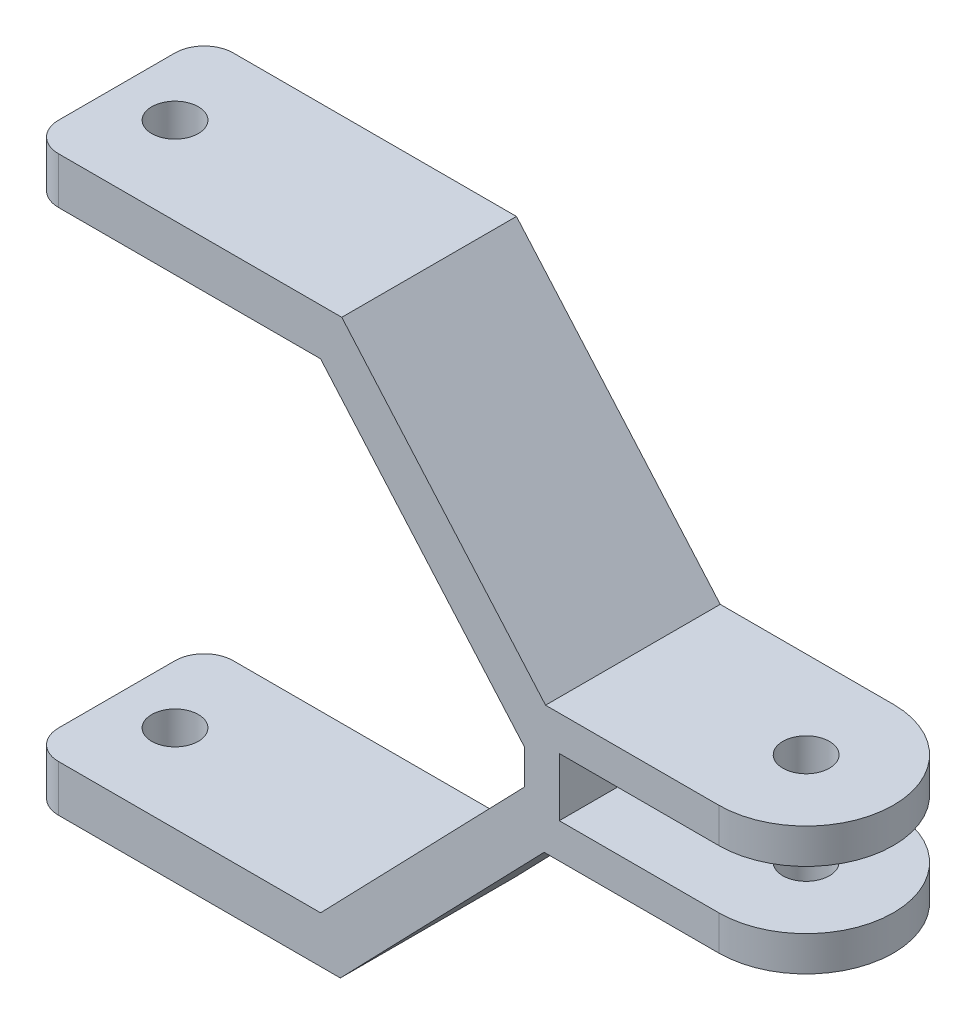
ISO-10303-21;
HEADER;
FILE_DESCRIPTION(('STEP AP214'),'2;1');
FILE_NAME('part.step','',(''),(''),'','','');
FILE_SCHEMA(('AUTOMOTIVE_DESIGN { 1 0 10303 214 1 1 1 1 }'));
ENDSEC;
DATA;
#1=APPLICATION_CONTEXT('core data for automotive mechanical design processes');
#2=APPLICATION_PROTOCOL_DEFINITION('international standard','automotive_design',2000,#1);
#3=PRODUCT_CONTEXT('',#1,'mechanical');
#4=PRODUCT('Part','Part','',(#3));
#5=PRODUCT_RELATED_PRODUCT_CATEGORY('part','',(#4));
#6=PRODUCT_DEFINITION_FORMATION('','',#4);
#7=PRODUCT_DEFINITION_CONTEXT('part definition',#1,'design');
#8=PRODUCT_DEFINITION('design','',#6,#7);
#9=PRODUCT_DEFINITION_SHAPE('','',#8);
#10=(LENGTH_UNIT() NAMED_UNIT(*) SI_UNIT(.MILLI.,.METRE.));
#11=(NAMED_UNIT(*) PLANE_ANGLE_UNIT() SI_UNIT($,.RADIAN.));
#12=(NAMED_UNIT(*) SI_UNIT($,.STERADIAN.) SOLID_ANGLE_UNIT());
#13=UNCERTAINTY_MEASURE_WITH_UNIT(LENGTH_MEASURE(1.E-05),#10,'distance_accuracy_value','');
#14=(GEOMETRIC_REPRESENTATION_CONTEXT(3) GLOBAL_UNCERTAINTY_ASSIGNED_CONTEXT((#13)) GLOBAL_UNIT_ASSIGNED_CONTEXT((#10,
#11,#12)) REPRESENTATION_CONTEXT('',''));
#15=CARTESIAN_POINT('',(0.,0.,0.));
#16=DIRECTION('',(0.,0.,1.));
#17=DIRECTION('',(1.,0.,0.));
#18=AXIS2_PLACEMENT_3D('',#15,#16,#17);
#19=CARTESIAN_POINT('',(-26.6964809757769,45.2,15.));
#20=DIRECTION('',(0.75420147757774,0.656643077493058,0.));
#21=DIRECTION('',(-0.656643077493058,0.75420147757774,0.));
#22=AXIS2_PLACEMENT_3D('',#19,#20,#21);
#23=PLANE('',#22);
#24=DIRECTION('',(0.656643077493058,-0.75420147757774,0.));
#25=VECTOR('',#24,1.);
#26=CARTESIAN_POINT('',(-26.6964809757769,45.2,0.));
#27=LINE('',#26,#25);
#28=CARTESIAN_POINT('',(-26.6964809757769,45.2,0.));
#29=VERTEX_POINT('',#28);
#30=CARTESIAN_POINT('',(-9.19648097577691,25.1,0.));
#31=VERTEX_POINT('',#30);
#32=EDGE_CURVE('E231',#29,#31,#27,.T.);
#33=ORIENTED_EDGE('',*,*,#32,.T.);
#34=DIRECTION('',(0.,0.,-1.));
#35=VECTOR('',#34,1.);
#36=CARTESIAN_POINT('',(-9.19648097577691,25.1,15.));
#37=LINE('',#36,#35);
#38=CARTESIAN_POINT('',(-9.19648097577691,25.1,15.));
#39=VERTEX_POINT('',#38);
#40=EDGE_CURVE('E332',#39,#31,#37,.T.);
#41=ORIENTED_EDGE('',*,*,#40,.F.);
#42=DIRECTION('',(0.656643077493058,-0.75420147757774,0.));
#43=VECTOR('',#42,1.);
#44=CARTESIAN_POINT('',(-26.6964809757769,45.2,15.));
#45=LINE('',#44,#43);
#46=CARTESIAN_POINT('',(-26.6964809757769,45.2,15.));
#47=VERTEX_POINT('',#46);
#48=EDGE_CURVE('E232',#47,#39,#45,.T.);
#49=ORIENTED_EDGE('',*,*,#48,.F.);
#50=DIRECTION('',(0.,0.,-1.));
#51=VECTOR('',#50,1.);
#52=CARTESIAN_POINT('',(-26.6964809757769,45.2,15.));
#53=LINE('',#52,#51);
#54=EDGE_CURVE('E267',#47,#29,#53,.T.);
#55=ORIENTED_EDGE('',*,*,#54,.T.);
#56=EDGE_LOOP('',(#33,#41,#49,#55));
#57=FACE_BOUND('',#56,.T.);
#58=ADVANCED_FACE('F33',(#57),#23,.F.);
#59=CARTESIAN_POINT('',(-9.19648097577691,25.1,15.));
#60=DIRECTION('',(1.,0.,0.));
#61=DIRECTION('',(0.,1.,0.));
#62=AXIS2_PLACEMENT_3D('',#59,#60,#61);
#63=PLANE('',#62);
#64=DIRECTION('',(0.,-1.,0.));
#65=VECTOR('',#64,1.);
#66=CARTESIAN_POINT('',(-9.19648097577691,25.1,0.));
#67=LINE('',#66,#65);
#68=CARTESIAN_POINT('',(-9.19648097577692,22.1,0.));
#69=VERTEX_POINT('',#68);
#70=EDGE_CURVE('E270',#31,#69,#67,.T.);
#71=ORIENTED_EDGE('',*,*,#70,.T.);
#72=DIRECTION('',(0.,0.,-1.));
#73=VECTOR('',#72,1.);
#74=CARTESIAN_POINT('',(-9.19648097577692,22.1,15.));
#75=LINE('',#74,#73);
#76=CARTESIAN_POINT('',(-9.19648097577692,22.1,15.));
#77=VERTEX_POINT('',#76);
#78=EDGE_CURVE('E329',#77,#69,#75,.T.);
#79=ORIENTED_EDGE('',*,*,#78,.F.);
#80=DIRECTION('',(0.,-1.,0.));
#81=VECTOR('',#80,1.);
#82=CARTESIAN_POINT('',(-9.19648097577691,25.1,15.));
#83=LINE('',#82,#81);
#84=EDGE_CURVE('E235',#39,#77,#83,.T.);
#85=ORIENTED_EDGE('',*,*,#84,.F.);
#86=ORIENTED_EDGE('',*,*,#40,.T.);
#87=EDGE_LOOP('',(#71,#79,#85,#86));
#88=FACE_BOUND('',#87,.T.);
#89=ADVANCED_FACE('F398',(#88),#63,.F.);
#90=CARTESIAN_POINT('',(-9.19648097577692,22.1,15.));
#91=DIRECTION('',(0.718922211716419,-0.695090536189907,0.));
#92=DIRECTION('',(0.695090536189907,0.718922211716419,0.));
#93=AXIS2_PLACEMENT_3D('',#90,#91,#92);
#94=PLANE('',#93);
#95=DIRECTION('',(-0.695090536189907,-0.718922211716419,0.));
#96=VECTOR('',#95,1.);
#97=CARTESIAN_POINT('',(-9.19648097577692,22.1,0.));
#98=LINE('',#97,#96);
#99=CARTESIAN_POINT('',(-26.6964809757769,4.,0.));
#100=VERTEX_POINT('',#99);
#101=EDGE_CURVE('E272',#69,#100,#98,.T.);
#102=ORIENTED_EDGE('',*,*,#101,.T.);
#103=DIRECTION('',(0.,0.,-1.));
#104=VECTOR('',#103,1.);
#105=CARTESIAN_POINT('',(-26.6964809757769,4.,15.));
#106=LINE('',#105,#104);
#107=CARTESIAN_POINT('',(-26.6964809757769,4.,15.));
#108=VERTEX_POINT('',#107);
#109=EDGE_CURVE('E326',#108,#100,#106,.T.);
#110=ORIENTED_EDGE('',*,*,#109,.F.);
#111=DIRECTION('',(-0.695090536189907,-0.718922211716419,0.));
#112=VECTOR('',#111,1.);
#113=CARTESIAN_POINT('',(-9.19648097577692,22.1,15.));
#114=LINE('',#113,#112);
#115=EDGE_CURVE('E238',#77,#108,#114,.T.);
#116=ORIENTED_EDGE('',*,*,#115,.F.);
#117=ORIENTED_EDGE('',*,*,#78,.T.);
#118=EDGE_LOOP('',(#102,#110,#116,#117));
#119=FACE_BOUND('',#118,.T.);
#120=ADVANCED_FACE('F386',(#119),#94,.F.);
#121=CARTESIAN_POINT('',(-51.6964809757769,3.99999999999999,15.));
#122=DIRECTION('',(0.,-1.,0.));
#123=DIRECTION('',(0.,0.,-1.));
#124=AXIS2_PLACEMENT_3D('',#121,#122,#123);
#125=PLANE('',#124);
#126=CARTESIAN_POINT('',(-46.6964809757769,3.99999999999999,7.5));
#127=DIRECTION('',(0.,-1.,0.));
#128=DIRECTION('',(0.,0.,-1.));
#129=AXIS2_PLACEMENT_3D('',#126,#127,#128);
#130=CIRCLE('',#129,2.);
#131=CARTESIAN_POINT('',(-44.6964809757769,4.,7.5));
#132=VERTEX_POINT('',#131);
#133=EDGE_CURVE('E228',#132,#132,#130,.T.);
#134=ORIENTED_EDGE('',*,*,#133,.T.);
#135=EDGE_LOOP('',(#134));
#136=FACE_BOUND('',#135,.T.);
#137=DIRECTION('',(0.,0.,-1.));
#138=VECTOR('',#137,1.);
#139=CARTESIAN_POINT('',(-51.6964809757769,3.99999999999999,15.));
#140=LINE('',#139,#138);
#141=CARTESIAN_POINT('',(-51.6964809757769,3.99999999999999,12.5));
#142=VERTEX_POINT('',#141);
#143=CARTESIAN_POINT('',(-51.6964809757769,3.99999999999999,2.5));
#144=VERTEX_POINT('',#143);
#145=EDGE_CURVE('E324',#142,#144,#140,.T.);
#146=ORIENTED_EDGE('',*,*,#145,.F.);
#147=CARTESIAN_POINT('',(-49.1964809757769,3.99999999999999,12.5));
#148=DIRECTION('',(0.,-1.,0.));
#149=DIRECTION('',(0.,0.,-1.));
#150=AXIS2_PLACEMENT_3D('',#147,#148,#149);
#151=CIRCLE('',#150,2.5);
#152=CARTESIAN_POINT('',(-49.1964809757769,3.99999999999999,15.));
#153=VERTEX_POINT('',#152);
#154=EDGE_CURVE('E11',#142,#153,#151,.F.);
#155=ORIENTED_EDGE('',*,*,#154,.T.);
#156=DIRECTION('',(-1.,0.,0.));
#157=VECTOR('',#156,1.);
#158=CARTESIAN_POINT('',(-26.6964809757769,4.,15.));
#159=LINE('',#158,#157);
#160=EDGE_CURVE('E240',#108,#153,#159,.T.);
#161=ORIENTED_EDGE('',*,*,#160,.F.);
#162=ORIENTED_EDGE('',*,*,#109,.T.);
#163=DIRECTION('',(-1.,0.,0.));
#164=VECTOR('',#163,1.);
#165=CARTESIAN_POINT('',(-51.6964809757769,3.99999999999999,0.));
#166=LINE('',#165,#164);
#167=CARTESIAN_POINT('',(-49.1964809757769,3.99999999999999,0.));
#168=VERTEX_POINT('',#167);
#169=EDGE_CURVE('E275',#100,#168,#166,.T.);
#170=ORIENTED_EDGE('',*,*,#169,.T.);
#171=CARTESIAN_POINT('',(-49.1964809757769,3.99999999999999,2.5));
#172=DIRECTION('',(0.,-1.,0.));
#173=DIRECTION('',(0.,0.,-1.));
#174=AXIS2_PLACEMENT_3D('',#171,#172,#173);
#175=CIRCLE('',#174,2.5);
#176=EDGE_CURVE('E41',#168,#144,#175,.F.);
#177=ORIENTED_EDGE('',*,*,#176,.T.);
#178=EDGE_LOOP('',(#146,#155,#161,#162,#170,#177));
#179=FACE_BOUND('',#178,.T.);
#180=ADVANCED_FACE('F384',(#136,#179),#125,.F.);
#181=CARTESIAN_POINT('',(-51.6964809757769,0.,15.));
#182=DIRECTION('',(1.,0.,0.));
#183=DIRECTION('',(0.,0.,-1.));
#184=AXIS2_PLACEMENT_3D('',#181,#182,#183);
#185=PLANE('',#184);
#186=DIRECTION('',(0.,0.,-1.));
#187=VECTOR('',#186,1.);
#188=CARTESIAN_POINT('',(-51.6964809757769,0.,15.));
#189=LINE('',#188,#187);
#190=CARTESIAN_POINT('',(-51.6964809757769,0.,12.5));
#191=VERTEX_POINT('',#190);
#192=CARTESIAN_POINT('',(-51.6964809757769,0.,2.5));
#193=VERTEX_POINT('',#192);
#194=EDGE_CURVE('E321',#191,#193,#189,.T.);
#195=ORIENTED_EDGE('',*,*,#194,.F.);
#196=DIRECTION('',(0.,-1.,0.));
#197=VECTOR('',#196,1.);
#198=CARTESIAN_POINT('',(-51.6964809757769,0.,12.5));
#199=LINE('',#198,#197);
#200=EDGE_CURVE('E54',#191,#142,#199,.F.);
#201=ORIENTED_EDGE('',*,*,#200,.T.);
#202=ORIENTED_EDGE('',*,*,#145,.T.);
#203=DIRECTION('',(0.,-1.,0.));
#204=VECTOR('',#203,1.);
#205=CARTESIAN_POINT('',(-51.6964809757769,0.,2.5));
#206=LINE('',#205,#204);
#207=EDGE_CURVE('E364',#144,#193,#206,.T.);
#208=ORIENTED_EDGE('',*,*,#207,.T.);
#209=EDGE_LOOP('',(#195,#201,#202,#208));
#210=FACE_BOUND('',#209,.T.);
#211=ADVANCED_FACE('F368',(#210),#185,.F.);
#212=CARTESIAN_POINT('',(-25.,0.,15.));
#213=DIRECTION('',(0.,1.,0.));
#214=DIRECTION('',(-1.,0.,0.));
#215=AXIS2_PLACEMENT_3D('',#212,#213,#214);
#216=PLANE('',#215);
#217=CARTESIAN_POINT('',(-46.6964809757769,0.,7.5));
#218=DIRECTION('',(0.,-1.,0.));
#219=DIRECTION('',(1.,0.,0.));
#220=AXIS2_PLACEMENT_3D('',#217,#218,#219);
#221=CIRCLE('',#220,2.);
#222=CARTESIAN_POINT('',(-44.6964809757769,0.,7.5));
#223=VERTEX_POINT('',#222);
#224=EDGE_CURVE('E219',#223,#223,#221,.T.);
#225=ORIENTED_EDGE('',*,*,#224,.F.);
#226=EDGE_LOOP('',(#225));
#227=FACE_BOUND('',#226,.T.);
#228=DIRECTION('',(1.,0.,0.));
#229=VECTOR('',#228,1.);
#230=CARTESIAN_POINT('',(-25.,0.,15.));
#231=LINE('',#230,#229);
#232=CARTESIAN_POINT('',(-49.1964809757769,0.,15.));
#233=VERTEX_POINT('',#232);
#234=CARTESIAN_POINT('',(-25.,0.,15.));
#235=VERTEX_POINT('',#234);
#236=EDGE_CURVE('E243',#233,#235,#231,.T.);
#237=ORIENTED_EDGE('',*,*,#236,.F.);
#238=CARTESIAN_POINT('',(-49.1964809757769,0.,12.5));
#239=DIRECTION('',(0.,1.,0.));
#240=DIRECTION('',(-1.,0.,0.));
#241=AXIS2_PLACEMENT_3D('',#238,#239,#240);
#242=CIRCLE('',#241,2.5);
#243=EDGE_CURVE('E362',#233,#191,#242,.F.);
#244=ORIENTED_EDGE('',*,*,#243,.T.);
#245=ORIENTED_EDGE('',*,*,#194,.T.);
#246=CARTESIAN_POINT('',(-49.1964809757769,0.,2.5));
#247=DIRECTION('',(0.,1.,0.));
#248=DIRECTION('',(-1.,0.,0.));
#249=AXIS2_PLACEMENT_3D('',#246,#247,#248);
#250=CIRCLE('',#249,2.5);
#251=CARTESIAN_POINT('',(-49.1964809757769,0.,0.));
#252=VERTEX_POINT('',#251);
#253=EDGE_CURVE('E360',#193,#252,#250,.F.);
#254=ORIENTED_EDGE('',*,*,#253,.T.);
#255=DIRECTION('',(1.,0.,0.));
#256=VECTOR('',#255,1.);
#257=CARTESIAN_POINT('',(-25.,0.,0.));
#258=LINE('',#257,#256);
#259=CARTESIAN_POINT('',(-25.,0.,0.));
#260=VERTEX_POINT('',#259);
#261=EDGE_CURVE('E277',#252,#260,#258,.T.);
#262=ORIENTED_EDGE('',*,*,#261,.T.);
#263=DIRECTION('',(0.,0.,-1.));
#264=VECTOR('',#263,1.);
#265=CARTESIAN_POINT('',(-25.,0.,15.));
#266=LINE('',#265,#264);
#267=EDGE_CURVE('E318',#235,#260,#266,.T.);
#268=ORIENTED_EDGE('',*,*,#267,.F.);
#269=EDGE_LOOP('',(#237,#244,#245,#254,#262,#268));
#270=FACE_BOUND('',#269,.T.);
#271=ADVANCED_FACE('F372',(#227,#270),#216,.F.);
#272=CARTESIAN_POINT('',(-7.5,18.1,15.));
#273=DIRECTION('',(-0.718922211716419,0.695090536189907,0.));
#274=DIRECTION('',(-0.695090536189907,-0.718922211716419,0.));
#275=AXIS2_PLACEMENT_3D('',#272,#273,#274);
#276=PLANE('',#275);
#277=DIRECTION('',(0.695090536189907,0.718922211716419,0.));
#278=VECTOR('',#277,1.);
#279=CARTESIAN_POINT('',(-7.5,18.1,0.));
#280=LINE('',#279,#278);
#281=CARTESIAN_POINT('',(-7.5,18.1,0.));
#282=VERTEX_POINT('',#281);
#283=EDGE_CURVE('E279',#260,#282,#280,.T.);
#284=ORIENTED_EDGE('',*,*,#283,.T.);
#285=DIRECTION('',(0.,0.,-1.));
#286=VECTOR('',#285,1.);
#287=CARTESIAN_POINT('',(-7.5,18.1,15.));
#288=LINE('',#287,#286);
#289=CARTESIAN_POINT('',(-7.5,18.1,15.));
#290=VERTEX_POINT('',#289);
#291=EDGE_CURVE('E315',#290,#282,#288,.T.);
#292=ORIENTED_EDGE('',*,*,#291,.F.);
#293=DIRECTION('',(0.695090536189907,0.718922211716419,0.));
#294=VECTOR('',#293,1.);
#295=CARTESIAN_POINT('',(-7.5,18.1,15.));
#296=LINE('',#295,#294);
#297=EDGE_CURVE('E245',#235,#290,#296,.T.);
#298=ORIENTED_EDGE('',*,*,#297,.F.);
#299=ORIENTED_EDGE('',*,*,#267,.T.);
#300=EDGE_LOOP('',(#284,#292,#298,#299));
#301=FACE_BOUND('',#300,.T.);
#302=ADVANCED_FACE('F474',(#301),#276,.F.);
#303=CARTESIAN_POINT('',(-7.5,18.1,15.));
#304=DIRECTION('',(0.,1.,0.));
#305=DIRECTION('',(0.,0.,1.));
#306=AXIS2_PLACEMENT_3D('',#303,#304,#305);
#307=PLANE('',#306);
#308=CARTESIAN_POINT('',(7.50000000000001,18.1,7.5));
#309=DIRECTION('',(0.,1.,0.));
#310=DIRECTION('',(0.,0.,1.));
#311=AXIS2_PLACEMENT_3D('',#308,#309,#310);
#312=CIRCLE('',#311,2.);
#313=CARTESIAN_POINT('',(7.50000000000001,18.1,9.5));
#314=VERTEX_POINT('',#313);
#315=EDGE_CURVE('E714',#314,#314,#312,.T.);
#316=ORIENTED_EDGE('',*,*,#315,.T.);
#317=EDGE_LOOP('',(#316));
#318=FACE_BOUND('',#317,.T.);
#319=DIRECTION('',(1.,0.,0.));
#320=VECTOR('',#319,1.);
#321=CARTESIAN_POINT('',(-7.5,18.1,0.));
#322=LINE('',#321,#320);
#323=CARTESIAN_POINT('',(7.50000000000001,18.1,0.));
#324=VERTEX_POINT('',#323);
#325=EDGE_CURVE('E281',#282,#324,#322,.T.);
#326=ORIENTED_EDGE('',*,*,#325,.T.);
#327=CARTESIAN_POINT('',(7.50000000000001,18.1,7.5));
#328=DIRECTION('',(0.,-1.,0.));
#329=DIRECTION('',(0.,0.,-1.));
#330=AXIS2_PLACEMENT_3D('',#327,#328,#329);
#331=CIRCLE('',#330,7.5);
#332=CARTESIAN_POINT('',(7.50000000000001,18.1,15.));
#333=VERTEX_POINT('',#332);
#334=EDGE_CURVE('E210',#324,#333,#331,.T.);
#335=ORIENTED_EDGE('',*,*,#334,.T.);
#336=DIRECTION('',(1.,0.,0.));
#337=VECTOR('',#336,1.);
#338=CARTESIAN_POINT('',(-7.5,18.1,15.));
#339=LINE('',#338,#337);
#340=EDGE_CURVE('E247',#290,#333,#339,.T.);
#341=ORIENTED_EDGE('',*,*,#340,.F.);
#342=ORIENTED_EDGE('',*,*,#291,.T.);
#343=EDGE_LOOP('',(#326,#335,#341,#342));
#344=FACE_BOUND('',#343,.T.);
#345=ADVANCED_FACE('F470',(#318,#344),#307,.F.);
#346=CARTESIAN_POINT('',(7.50000000000001,21.1,15.));
#347=DIRECTION('',(0.,-1.,0.));
#348=DIRECTION('',(1.,0.,0.));
#349=AXIS2_PLACEMENT_3D('',#346,#347,#348);
#350=PLANE('',#349);
#351=CARTESIAN_POINT('',(7.50000000000001,21.1,7.5));
#352=DIRECTION('',(0.,-1.,0.));
#353=DIRECTION('',(1.,0.,0.));
#354=AXIS2_PLACEMENT_3D('',#351,#352,#353);
#355=CIRCLE('',#354,2.);
#356=CARTESIAN_POINT('',(9.50000000000001,21.1,7.5));
#357=VERTEX_POINT('',#356);
#358=EDGE_CURVE('E208',#357,#357,#355,.T.);
#359=ORIENTED_EDGE('',*,*,#358,.T.);
#360=EDGE_LOOP('',(#359));
#361=FACE_BOUND('',#360,.T.);
#362=DIRECTION('',(-1.,0.,0.));
#363=VECTOR('',#362,1.);
#364=CARTESIAN_POINT('',(7.50000000000001,21.1,15.));
#365=LINE('',#364,#363);
#366=CARTESIAN_POINT('',(7.50000000000001,21.1,15.));
#367=VERTEX_POINT('',#366);
#368=CARTESIAN_POINT('',(-6.19648097577692,21.1,15.));
#369=VERTEX_POINT('',#368);
#370=EDGE_CURVE('E251',#367,#369,#365,.T.);
#371=ORIENTED_EDGE('',*,*,#370,.F.);
#372=CARTESIAN_POINT('',(7.50000000000001,21.1,7.5));
#373=DIRECTION('',(0.,-1.,0.));
#374=DIRECTION('',(0.,0.,-1.));
#375=AXIS2_PLACEMENT_3D('',#372,#373,#374);
#376=CIRCLE('',#375,7.5);
#377=CARTESIAN_POINT('',(7.50000000000001,21.1,0.));
#378=VERTEX_POINT('',#377);
#379=EDGE_CURVE('E216',#378,#367,#376,.T.);
#380=ORIENTED_EDGE('',*,*,#379,.F.);
#381=DIRECTION('',(-1.,0.,0.));
#382=VECTOR('',#381,1.);
#383=CARTESIAN_POINT('',(7.50000000000001,21.1,0.));
#384=LINE('',#383,#382);
#385=CARTESIAN_POINT('',(-6.19648097577692,21.1,0.));
#386=VERTEX_POINT('',#385);
#387=EDGE_CURVE('E286',#378,#386,#384,.T.);
#388=ORIENTED_EDGE('',*,*,#387,.T.);
#389=DIRECTION('',(0.,0.,-1.));
#390=VECTOR('',#389,1.);
#391=CARTESIAN_POINT('',(-6.19648097577692,21.1,15.));
#392=LINE('',#391,#390);
#393=EDGE_CURVE('E312',#369,#386,#392,.T.);
#394=ORIENTED_EDGE('',*,*,#393,.F.);
#395=EDGE_LOOP('',(#371,#380,#388,#394));
#396=FACE_BOUND('',#395,.T.);
#397=ADVANCED_FACE('F466',(#361,#396),#350,.F.);
#398=CARTESIAN_POINT('',(-6.19648097577692,26.1,15.));
#399=DIRECTION('',(-1.,0.,0.));
#400=DIRECTION('',(0.,-1.,0.));
#401=AXIS2_PLACEMENT_3D('',#398,#399,#400);
#402=PLANE('',#401);
#403=DIRECTION('',(0.,1.,0.));
#404=VECTOR('',#403,1.);
#405=CARTESIAN_POINT('',(-6.19648097577692,26.1,0.));
#406=LINE('',#405,#404);
#407=CARTESIAN_POINT('',(-6.19648097577692,26.1,0.));
#408=VERTEX_POINT('',#407);
#409=EDGE_CURVE('E288',#386,#408,#406,.T.);
#410=ORIENTED_EDGE('',*,*,#409,.T.);
#411=DIRECTION('',(0.,0.,-1.));
#412=VECTOR('',#411,1.);
#413=CARTESIAN_POINT('',(-6.19648097577692,26.1,15.));
#414=LINE('',#413,#412);
#415=CARTESIAN_POINT('',(-6.19648097577692,26.1,15.));
#416=VERTEX_POINT('',#415);
#417=EDGE_CURVE('E309',#416,#408,#414,.T.);
#418=ORIENTED_EDGE('',*,*,#417,.F.);
#419=DIRECTION('',(0.,1.,0.));
#420=VECTOR('',#419,1.);
#421=CARTESIAN_POINT('',(-6.19648097577692,26.1,15.));
#422=LINE('',#421,#420);
#423=EDGE_CURVE('E253',#369,#416,#422,.T.);
#424=ORIENTED_EDGE('',*,*,#423,.F.);
#425=ORIENTED_EDGE('',*,*,#393,.T.);
#426=EDGE_LOOP('',(#410,#418,#424,#425));
#427=FACE_BOUND('',#426,.T.);
#428=ADVANCED_FACE('F462',(#427),#402,.F.);
#429=CARTESIAN_POINT('',(7.50000000000001,26.1,15.));
#430=DIRECTION('',(0.,1.,0.));
#431=DIRECTION('',(0.,0.,1.));
#432=AXIS2_PLACEMENT_3D('',#429,#430,#431);
#433=PLANE('',#432);
#434=CARTESIAN_POINT('',(7.50000000000001,26.1,7.5));
#435=DIRECTION('',(0.,1.,0.));
#436=DIRECTION('',(0.,0.,1.));
#437=AXIS2_PLACEMENT_3D('',#434,#435,#436);
#438=CIRCLE('',#437,2.);
#439=CARTESIAN_POINT('',(7.50000000000001,26.1,9.5));
#440=VERTEX_POINT('',#439);
#441=EDGE_CURVE('E213',#440,#440,#438,.T.);
#442=ORIENTED_EDGE('',*,*,#441,.T.);
#443=EDGE_LOOP('',(#442));
#444=FACE_BOUND('',#443,.T.);
#445=DIRECTION('',(1.,0.,0.));
#446=VECTOR('',#445,1.);
#447=CARTESIAN_POINT('',(7.50000000000001,26.1,0.));
#448=LINE('',#447,#446);
#449=CARTESIAN_POINT('',(7.50000000000001,26.1,0.));
#450=VERTEX_POINT('',#449);
#451=EDGE_CURVE('E203',#408,#450,#448,.T.);
#452=ORIENTED_EDGE('',*,*,#451,.T.);
#453=CARTESIAN_POINT('',(7.50000000000001,26.1,7.5));
#454=DIRECTION('',(0.,1.,0.));
#455=DIRECTION('',(0.,0.,1.));
#456=AXIS2_PLACEMENT_3D('',#453,#454,#455);
#457=CIRCLE('',#456,7.5);
#458=CARTESIAN_POINT('',(7.50000000000001,26.1,15.));
#459=VERTEX_POINT('',#458);
#460=EDGE_CURVE('E202',#459,#450,#457,.T.);
#461=ORIENTED_EDGE('',*,*,#460,.F.);
#462=DIRECTION('',(1.,0.,0.));
#463=VECTOR('',#462,1.);
#464=CARTESIAN_POINT('',(7.50000000000001,26.1,15.));
#465=LINE('',#464,#463);
#466=EDGE_CURVE('E255',#416,#459,#465,.T.);
#467=ORIENTED_EDGE('',*,*,#466,.F.);
#468=ORIENTED_EDGE('',*,*,#417,.T.);
#469=EDGE_LOOP('',(#452,#461,#467,#468));
#470=FACE_BOUND('',#469,.T.);
#471=ADVANCED_FACE('F458',(#444,#470),#433,.F.);
#472=CARTESIAN_POINT('',(-7.3754454423558,29.1,15.));
#473=DIRECTION('',(0.,-1.,0.));
#474=DIRECTION('',(0.,0.,-1.));
#475=AXIS2_PLACEMENT_3D('',#472,#473,#474);
#476=PLANE('',#475);
#477=CARTESIAN_POINT('',(7.50000000000001,29.1,7.5));
#478=DIRECTION('',(0.,1.,0.));
#479=DIRECTION('',(0.,0.,1.));
#480=AXIS2_PLACEMENT_3D('',#477,#478,#479);
#481=CIRCLE('',#480,2.);
#482=CARTESIAN_POINT('',(7.50000000000001,29.1,9.5));
#483=VERTEX_POINT('',#482);
#484=EDGE_CURVE('E711',#483,#483,#481,.T.);
#485=ORIENTED_EDGE('',*,*,#484,.F.);
#486=EDGE_LOOP('',(#485));
#487=FACE_BOUND('',#486,.T.);
#488=DIRECTION('',(-1.,0.,0.));
#489=VECTOR('',#488,1.);
#490=CARTESIAN_POINT('',(-7.3754454423558,29.1,15.));
#491=LINE('',#490,#489);
#492=CARTESIAN_POINT('',(7.50000000000001,29.1,15.));
#493=VERTEX_POINT('',#492);
#494=CARTESIAN_POINT('',(-7.3754454423558,29.1,15.));
#495=VERTEX_POINT('',#494);
#496=EDGE_CURVE('E207',#493,#495,#491,.T.);
#497=ORIENTED_EDGE('',*,*,#496,.F.);
#498=CARTESIAN_POINT('',(7.50000000000001,29.1,7.5));
#499=DIRECTION('',(0.,1.,0.));
#500=DIRECTION('',(0.,0.,1.));
#501=AXIS2_PLACEMENT_3D('',#498,#499,#500);
#502=CIRCLE('',#501,7.5);
#503=CARTESIAN_POINT('',(7.50000000000001,29.1,0.));
#504=VERTEX_POINT('',#503);
#505=EDGE_CURVE('E200',#493,#504,#502,.T.);
#506=ORIENTED_EDGE('',*,*,#505,.T.);
#507=DIRECTION('',(-1.,0.,0.));
#508=VECTOR('',#507,1.);
#509=CARTESIAN_POINT('',(-7.3754454423558,29.1,0.));
#510=LINE('',#509,#508);
#511=CARTESIAN_POINT('',(-7.3754454423558,29.1,0.));
#512=VERTEX_POINT('',#511);
#513=EDGE_CURVE('E182',#504,#512,#510,.T.);
#514=ORIENTED_EDGE('',*,*,#513,.T.);
#515=DIRECTION('',(0.,0.,-1.));
#516=VECTOR('',#515,1.);
#517=CARTESIAN_POINT('',(-7.3754454423558,29.1,15.));
#518=LINE('',#517,#516);
#519=EDGE_CURVE('E307',#495,#512,#518,.T.);
#520=ORIENTED_EDGE('',*,*,#519,.F.);
#521=EDGE_LOOP('',(#497,#506,#514,#520));
#522=FACE_BOUND('',#521,.T.);
#523=ADVANCED_FACE('F206',(#487,#522),#476,.F.);
#524=CARTESIAN_POINT('',(-24.8754454423558,49.2,15.));
#525=DIRECTION('',(-0.75420147757774,-0.656643077493058,0.));
#526=DIRECTION('',(0.656643077493058,-0.75420147757774,0.));
#527=AXIS2_PLACEMENT_3D('',#524,#525,#526);
#528=PLANE('',#527);
#529=DIRECTION('',(-0.656643077493058,0.75420147757774,0.));
#530=VECTOR('',#529,1.);
#531=CARTESIAN_POINT('',(-24.8754454423558,49.2,0.));
#532=LINE('',#531,#530);
#533=CARTESIAN_POINT('',(-24.8754454423558,49.2,0.));
#534=VERTEX_POINT('',#533);
#535=EDGE_CURVE('E190',#512,#534,#532,.T.);
#536=ORIENTED_EDGE('',*,*,#535,.T.);
#537=DIRECTION('',(0.,0.,-1.));
#538=VECTOR('',#537,1.);
#539=CARTESIAN_POINT('',(-24.8754454423558,49.2,15.));
#540=LINE('',#539,#538);
#541=CARTESIAN_POINT('',(-24.8754454423558,49.2,15.));
#542=VERTEX_POINT('',#541);
#543=EDGE_CURVE('E304',#542,#534,#540,.T.);
#544=ORIENTED_EDGE('',*,*,#543,.F.);
#545=DIRECTION('',(-0.656643077493058,0.75420147757774,0.));
#546=VECTOR('',#545,1.);
#547=CARTESIAN_POINT('',(-24.8754454423558,49.2,15.));
#548=LINE('',#547,#546);
#549=EDGE_CURVE('E260',#495,#542,#548,.T.);
#550=ORIENTED_EDGE('',*,*,#549,.F.);
#551=ORIENTED_EDGE('',*,*,#519,.T.);
#552=EDGE_LOOP('',(#536,#544,#550,#551));
#553=FACE_BOUND('',#552,.T.);
#554=ADVANCED_FACE('F434',(#553),#528,.F.);
#555=CARTESIAN_POINT('',(-24.8754454423558,49.2,15.));
#556=DIRECTION('',(0.,-1.,0.));
#557=DIRECTION('',(0.,0.,-1.));
#558=AXIS2_PLACEMENT_3D('',#555,#556,#557);
#559=PLANE('',#558);
#560=CARTESIAN_POINT('',(-46.6964809757769,49.2,7.5));
#561=DIRECTION('',(0.,-1.,0.));
#562=DIRECTION('',(0.,0.,-1.));
#563=AXIS2_PLACEMENT_3D('',#560,#561,#562);
#564=CIRCLE('',#563,2.);
#565=CARTESIAN_POINT('',(-44.6964809757769,49.2,7.5));
#566=VERTEX_POINT('',#565);
#567=EDGE_CURVE('E224',#566,#566,#564,.F.);
#568=ORIENTED_EDGE('',*,*,#567,.F.);
#569=EDGE_LOOP('',(#568));
#570=FACE_BOUND('',#569,.T.);
#571=DIRECTION('',(0.,0.,-1.));
#572=VECTOR('',#571,1.);
#573=CARTESIAN_POINT('',(-51.6964809757769,49.2,15.));
#574=LINE('',#573,#572);
#575=CARTESIAN_POINT('',(-51.6964809757769,49.2,12.5));
#576=VERTEX_POINT('',#575);
#577=CARTESIAN_POINT('',(-51.6964809757769,49.2,2.5));
#578=VERTEX_POINT('',#577);
#579=EDGE_CURVE('E301',#576,#578,#574,.T.);
#580=ORIENTED_EDGE('',*,*,#579,.F.);
#581=CARTESIAN_POINT('',(-49.1964809757769,49.2,12.5));
#582=DIRECTION('',(0.,-1.,0.));
#583=DIRECTION('',(0.,0.,-1.));
#584=AXIS2_PLACEMENT_3D('',#581,#582,#583);
#585=CIRCLE('',#584,2.5);
#586=CARTESIAN_POINT('',(-49.1964809757769,49.2,15.));
#587=VERTEX_POINT('',#586);
#588=EDGE_CURVE('E354',#576,#587,#585,.F.);
#589=ORIENTED_EDGE('',*,*,#588,.T.);
#590=DIRECTION('',(-1.,0.,0.));
#591=VECTOR('',#590,1.);
#592=CARTESIAN_POINT('',(-24.8754454423558,49.2,15.));
#593=LINE('',#592,#591);
#594=EDGE_CURVE('E262',#542,#587,#593,.T.);
#595=ORIENTED_EDGE('',*,*,#594,.F.);
#596=ORIENTED_EDGE('',*,*,#543,.T.);
#597=DIRECTION('',(-1.,0.,0.));
#598=VECTOR('',#597,1.);
#599=CARTESIAN_POINT('',(-24.8754454423558,49.2,0.));
#600=LINE('',#599,#598);
#601=CARTESIAN_POINT('',(-49.1964809757769,49.2,0.));
#602=VERTEX_POINT('',#601);
#603=EDGE_CURVE('E292',#534,#602,#600,.T.);
#604=ORIENTED_EDGE('',*,*,#603,.T.);
#605=CARTESIAN_POINT('',(-49.1964809757769,49.2,2.5));
#606=DIRECTION('',(0.,-1.,0.));
#607=DIRECTION('',(0.,0.,-1.));
#608=AXIS2_PLACEMENT_3D('',#605,#606,#607);
#609=CIRCLE('',#608,2.5);
#610=EDGE_CURVE('E352',#602,#578,#609,.F.);
#611=ORIENTED_EDGE('',*,*,#610,.T.);
#612=EDGE_LOOP('',(#580,#589,#595,#596,#604,#611));
#613=FACE_BOUND('',#612,.T.);
#614=ADVANCED_FACE('F422',(#570,#613),#559,.F.);
#615=CARTESIAN_POINT('',(-51.6964809757769,45.2,15.));
#616=DIRECTION('',(1.,0.,0.));
#617=DIRECTION('',(0.,0.,-1.));
#618=AXIS2_PLACEMENT_3D('',#615,#616,#617);
#619=PLANE('',#618);
#620=DIRECTION('',(0.,0.,-1.));
#621=VECTOR('',#620,1.);
#622=CARTESIAN_POINT('',(-51.6964809757769,45.2,15.));
#623=LINE('',#622,#621);
#624=CARTESIAN_POINT('',(-51.6964809757769,45.2,12.5));
#625=VERTEX_POINT('',#624);
#626=CARTESIAN_POINT('',(-51.6964809757769,45.2,2.5));
#627=VERTEX_POINT('',#626);
#628=EDGE_CURVE('E298',#625,#627,#623,.T.);
#629=ORIENTED_EDGE('',*,*,#628,.F.);
#630=DIRECTION('',(0.,-1.,0.));
#631=VECTOR('',#630,1.);
#632=CARTESIAN_POINT('',(-51.6964809757769,45.2,12.5));
#633=LINE('',#632,#631);
#634=EDGE_CURVE('E350',#625,#576,#633,.F.);
#635=ORIENTED_EDGE('',*,*,#634,.T.);
#636=ORIENTED_EDGE('',*,*,#579,.T.);
#637=DIRECTION('',(0.,-1.,0.));
#638=VECTOR('',#637,1.);
#639=CARTESIAN_POINT('',(-51.6964809757769,45.2,2.5));
#640=LINE('',#639,#638);
#641=EDGE_CURVE('E347',#578,#627,#640,.T.);
#642=ORIENTED_EDGE('',*,*,#641,.T.);
#643=EDGE_LOOP('',(#629,#635,#636,#642));
#644=FACE_BOUND('',#643,.T.);
#645=ADVANCED_FACE('F426',(#644),#619,.F.);
#646=CARTESIAN_POINT('',(-26.6964809757769,45.2,15.));
#647=DIRECTION('',(0.,1.,0.));
#648=DIRECTION('',(0.,0.,1.));
#649=AXIS2_PLACEMENT_3D('',#646,#647,#648);
#650=PLANE('',#649);
#651=CARTESIAN_POINT('',(-46.6964809757769,45.2,7.5));
#652=DIRECTION('',(0.,1.,0.));
#653=DIRECTION('',(0.,0.,1.));
#654=AXIS2_PLACEMENT_3D('',#651,#652,#653);
#655=CIRCLE('',#654,2.);
#656=CARTESIAN_POINT('',(-44.6964809757769,45.2,7.5));
#657=VERTEX_POINT('',#656);
#658=EDGE_CURVE('E227',#657,#657,#655,.T.);
#659=ORIENTED_EDGE('',*,*,#658,.T.);
#660=EDGE_LOOP('',(#659));
#661=FACE_BOUND('',#660,.T.);
#662=DIRECTION('',(1.,0.,0.));
#663=VECTOR('',#662,1.);
#664=CARTESIAN_POINT('',(-47.6964809757769,45.2,15.));
#665=LINE('',#664,#663);
#666=CARTESIAN_POINT('',(-49.1964809757769,45.2,15.));
#667=VERTEX_POINT('',#666);
#668=EDGE_CURVE('E265',#667,#47,#665,.T.);
#669=ORIENTED_EDGE('',*,*,#668,.F.);
#670=CARTESIAN_POINT('',(-49.1964809757769,45.2,12.5));
#671=DIRECTION('',(0.,1.,0.));
#672=DIRECTION('',(0.,0.,1.));
#673=AXIS2_PLACEMENT_3D('',#670,#671,#672);
#674=CIRCLE('',#673,2.5);
#675=EDGE_CURVE('E345',#667,#625,#674,.F.);
#676=ORIENTED_EDGE('',*,*,#675,.T.);
#677=ORIENTED_EDGE('',*,*,#628,.T.);
#678=CARTESIAN_POINT('',(-49.1964809757769,45.2,2.5));
#679=DIRECTION('',(0.,1.,0.));
#680=DIRECTION('',(0.,0.,1.));
#681=AXIS2_PLACEMENT_3D('',#678,#679,#680);
#682=CIRCLE('',#681,2.5);
#683=CARTESIAN_POINT('',(-49.1964809757769,45.2,0.));
#684=VERTEX_POINT('',#683);
#685=EDGE_CURVE('E343',#627,#684,#682,.F.);
#686=ORIENTED_EDGE('',*,*,#685,.T.);
#687=DIRECTION('',(1.,0.,0.));
#688=VECTOR('',#687,1.);
#689=CARTESIAN_POINT('',(-26.6964809757769,45.2,0.));
#690=LINE('',#689,#688);
#691=EDGE_CURVE('E236',#684,#29,#690,.T.);
#692=ORIENTED_EDGE('',*,*,#691,.T.);
#693=ORIENTED_EDGE('',*,*,#54,.F.);
#694=EDGE_LOOP('',(#669,#676,#677,#686,#692,#693));
#695=FACE_BOUND('',#694,.T.);
#696=ADVANCED_FACE('F437',(#661,#695),#650,.F.);
#697=CARTESIAN_POINT('',(0.,0.,15.));
#698=DIRECTION('',(0.,0.,-1.));
#699=DIRECTION('',(-1.,0.,0.));
#700=AXIS2_PLACEMENT_3D('',#697,#698,#699);
#701=PLANE('',#700);
#702=ORIENTED_EDGE('',*,*,#594,.T.);
#703=DIRECTION('',(0.,-1.,0.));
#704=VECTOR('',#703,1.);
#705=CARTESIAN_POINT('',(-49.1964809757769,0.,15.));
#706=LINE('',#705,#704);
#707=EDGE_CURVE('E340',#587,#667,#706,.T.);
#708=ORIENTED_EDGE('',*,*,#707,.T.);
#709=ORIENTED_EDGE('',*,*,#668,.T.);
#710=ORIENTED_EDGE('',*,*,#48,.T.);
#711=ORIENTED_EDGE('',*,*,#84,.T.);
#712=ORIENTED_EDGE('',*,*,#115,.T.);
#713=ORIENTED_EDGE('',*,*,#160,.T.);
#714=DIRECTION('',(0.,-1.,0.));
#715=VECTOR('',#714,1.);
#716=CARTESIAN_POINT('',(-49.1964809757769,0.,15.));
#717=LINE('',#716,#715);
#718=EDGE_CURVE('E335',#153,#233,#717,.T.);
#719=ORIENTED_EDGE('',*,*,#718,.T.);
#720=ORIENTED_EDGE('',*,*,#236,.T.);
#721=ORIENTED_EDGE('',*,*,#297,.T.);
#722=ORIENTED_EDGE('',*,*,#340,.T.);
#723=DIRECTION('',(0.,1.,0.));
#724=VECTOR('',#723,1.);
#725=CARTESIAN_POINT('',(7.50000000000001,18.1,15.));
#726=LINE('',#725,#724);
#727=EDGE_CURVE('E249',#333,#367,#726,.T.);
#728=ORIENTED_EDGE('',*,*,#727,.T.);
#729=ORIENTED_EDGE('',*,*,#370,.T.);
#730=ORIENTED_EDGE('',*,*,#423,.T.);
#731=ORIENTED_EDGE('',*,*,#466,.T.);
#732=DIRECTION('',(0.,1.,0.));
#733=VECTOR('',#732,1.);
#734=CARTESIAN_POINT('',(7.50000000000001,26.1,15.));
#735=LINE('',#734,#733);
#736=EDGE_CURVE('E257',#459,#493,#735,.T.);
#737=ORIENTED_EDGE('',*,*,#736,.T.);
#738=ORIENTED_EDGE('',*,*,#496,.T.);
#739=ORIENTED_EDGE('',*,*,#549,.T.);
#740=EDGE_LOOP('',(#702,#708,#709,#710,#711,#712,#713,#719,#720,#721,#722,#728,#729,#730,#731,
#737,#738,#739));
#741=FACE_BOUND('',#740,.T.);
#742=ADVANCED_FACE('F380',(#741),#701,.F.);
#743=CARTESIAN_POINT('',(0.,0.,0.));
#744=DIRECTION('',(0.,0.,-1.));
#745=DIRECTION('',(-1.,0.,0.));
#746=AXIS2_PLACEMENT_3D('',#743,#744,#745);
#747=PLANE('',#746);
#748=ORIENTED_EDGE('',*,*,#691,.F.);
#749=DIRECTION('',(0.,-1.,0.));
#750=VECTOR('',#749,1.);
#751=CARTESIAN_POINT('',(-49.1964809757769,49.2,0.));
#752=LINE('',#751,#750);
#753=EDGE_CURVE('E358',#684,#602,#752,.F.);
#754=ORIENTED_EDGE('',*,*,#753,.T.);
#755=ORIENTED_EDGE('',*,*,#603,.F.);
#756=ORIENTED_EDGE('',*,*,#535,.F.);
#757=ORIENTED_EDGE('',*,*,#513,.F.);
#758=DIRECTION('',(0.,1.,0.));
#759=VECTOR('',#758,1.);
#760=CARTESIAN_POINT('',(7.50000000000001,26.1,0.));
#761=LINE('',#760,#759);
#762=EDGE_CURVE('E187',#450,#504,#761,.T.);
#763=ORIENTED_EDGE('',*,*,#762,.F.);
#764=ORIENTED_EDGE('',*,*,#451,.F.);
#765=ORIENTED_EDGE('',*,*,#409,.F.);
#766=ORIENTED_EDGE('',*,*,#387,.F.);
#767=DIRECTION('',(0.,1.,0.));
#768=VECTOR('',#767,1.);
#769=CARTESIAN_POINT('',(7.50000000000001,18.1,0.));
#770=LINE('',#769,#768);
#771=EDGE_CURVE('E283',#324,#378,#770,.T.);
#772=ORIENTED_EDGE('',*,*,#771,.F.);
#773=ORIENTED_EDGE('',*,*,#325,.F.);
#774=ORIENTED_EDGE('',*,*,#283,.F.);
#775=ORIENTED_EDGE('',*,*,#261,.F.);
#776=DIRECTION('',(0.,-1.,0.));
#777=VECTOR('',#776,1.);
#778=CARTESIAN_POINT('',(-49.1964809757769,3.99999999999999,0.));
#779=LINE('',#778,#777);
#780=EDGE_CURVE('E356',#252,#168,#779,.F.);
#781=ORIENTED_EDGE('',*,*,#780,.T.);
#782=ORIENTED_EDGE('',*,*,#169,.F.);
#783=ORIENTED_EDGE('',*,*,#101,.F.);
#784=ORIENTED_EDGE('',*,*,#70,.F.);
#785=ORIENTED_EDGE('',*,*,#32,.F.);
#786=EDGE_LOOP('',(#748,#754,#755,#756,#757,#763,#764,#765,#766,#772,#773,#774,#775,#781,#782,
#783,#784,#785));
#787=FACE_BOUND('',#786,.T.);
#788=ADVANCED_FACE('F185',(#787),#747,.T.);
#789=CARTESIAN_POINT('',(-46.6964809757769,54.8568542494924,7.5));
#790=DIRECTION('',(0.,-1.,0.));
#791=DIRECTION('',(1.,0.,0.));
#792=AXIS2_PLACEMENT_3D('',#789,#790,#791);
#793=CYLINDRICAL_SURFACE('',#792,2.);
#794=CARTESIAN_POINT('',(-44.6964809757769,49.2,7.5));
#795=CARTESIAN_POINT('',(-44.6964809757769,49.1583333333333,7.5));
#796=CARTESIAN_POINT('',(-44.6964809757769,49.1166666666667,7.5));
#797=CARTESIAN_POINT('',(-44.6964809757769,49.0333333333333,7.5));
#798=CARTESIAN_POINT('',(-44.6964809757769,48.9916666666667,7.5));
#799=CARTESIAN_POINT('',(-44.6964809757769,48.9083333333333,7.5));
#800=CARTESIAN_POINT('',(-44.6964809757769,48.8666666666667,7.5));
#801=CARTESIAN_POINT('',(-44.6964809757769,48.7833333333333,7.5));
#802=CARTESIAN_POINT('',(-44.6964809757769,48.7416666666667,7.5));
#803=CARTESIAN_POINT('',(-44.6964809757769,48.6583333333333,7.5));
#804=CARTESIAN_POINT('',(-44.6964809757769,48.6166666666667,7.5));
#805=CARTESIAN_POINT('',(-44.6964809757769,48.5333333333333,7.5));
#806=CARTESIAN_POINT('',(-44.6964809757769,48.4916666666667,7.5));
#807=CARTESIAN_POINT('',(-44.6964809757769,48.4083333333333,7.5));
#808=CARTESIAN_POINT('',(-44.6964809757769,48.3666666666667,7.5));
#809=CARTESIAN_POINT('',(-44.6964809757769,48.2833333333333,7.5));
#810=CARTESIAN_POINT('',(-44.6964809757769,48.2416666666667,7.5));
#811=CARTESIAN_POINT('',(-44.6964809757769,48.1583333333333,7.5));
#812=CARTESIAN_POINT('',(-44.6964809757769,48.1166666666667,7.5));
#813=CARTESIAN_POINT('',(-44.6964809757769,48.0333333333333,7.5));
#814=CARTESIAN_POINT('',(-44.6964809757769,47.9916666666667,7.5));
#815=CARTESIAN_POINT('',(-44.6964809757769,47.9083333333333,7.5));
#816=CARTESIAN_POINT('',(-44.6964809757769,47.8666666666667,7.5));
#817=CARTESIAN_POINT('',(-44.6964809757769,47.7833333333333,7.5));
#818=CARTESIAN_POINT('',(-44.6964809757769,47.7416666666667,7.5));
#819=CARTESIAN_POINT('',(-44.6964809757769,47.6583333333333,7.5));
#820=CARTESIAN_POINT('',(-44.6964809757769,47.6166666666667,7.5));
#821=CARTESIAN_POINT('',(-44.6964809757769,47.5333333333333,7.5));
#822=CARTESIAN_POINT('',(-44.6964809757769,47.4916666666667,7.5));
#823=CARTESIAN_POINT('',(-44.6964809757769,47.4083333333333,7.5));
#824=CARTESIAN_POINT('',(-44.6964809757769,47.3666666666667,7.5));
#825=CARTESIAN_POINT('',(-44.6964809757769,47.2833333333333,7.5));
#826=CARTESIAN_POINT('',(-44.6964809757769,47.2416666666667,7.5));
#827=CARTESIAN_POINT('',(-44.6964809757769,47.1583333333333,7.5));
#828=CARTESIAN_POINT('',(-44.6964809757769,47.1166666666667,7.5));
#829=CARTESIAN_POINT('',(-44.6964809757769,47.0333333333333,7.5));
#830=CARTESIAN_POINT('',(-44.6964809757769,46.9916666666667,7.5));
#831=CARTESIAN_POINT('',(-44.6964809757769,46.9083333333333,7.5));
#832=CARTESIAN_POINT('',(-44.6964809757769,46.8666666666667,7.5));
#833=CARTESIAN_POINT('',(-44.6964809757769,46.7833333333333,7.5));
#834=CARTESIAN_POINT('',(-44.6964809757769,46.7416666666667,7.5));
#835=CARTESIAN_POINT('',(-44.6964809757769,46.6583333333333,7.5));
#836=CARTESIAN_POINT('',(-44.6964809757769,46.6166666666667,7.5));
#837=CARTESIAN_POINT('',(-44.6964809757769,46.5333333333333,7.5));
#838=CARTESIAN_POINT('',(-44.6964809757769,46.4916666666667,7.5));
#839=CARTESIAN_POINT('',(-44.6964809757769,46.4083333333333,7.5));
#840=CARTESIAN_POINT('',(-44.6964809757769,46.3666666666667,7.5));
#841=CARTESIAN_POINT('',(-44.6964809757769,46.2833333333333,7.5));
#842=CARTESIAN_POINT('',(-44.6964809757769,46.2416666666667,7.5));
#843=CARTESIAN_POINT('',(-44.6964809757769,46.1583333333333,7.5));
#844=CARTESIAN_POINT('',(-44.6964809757769,46.1166666666667,7.5));
#845=CARTESIAN_POINT('',(-44.6964809757769,46.0333333333333,7.5));
#846=CARTESIAN_POINT('',(-44.6964809757769,45.9916666666667,7.5));
#847=CARTESIAN_POINT('',(-44.6964809757769,45.9083333333333,7.5));
#848=CARTESIAN_POINT('',(-44.6964809757769,45.8666666666667,7.5));
#849=CARTESIAN_POINT('',(-44.6964809757769,45.7833333333333,7.5));
#850=CARTESIAN_POINT('',(-44.6964809757769,45.7416666666667,7.5));
#851=CARTESIAN_POINT('',(-44.6964809757769,45.6583333333333,7.5));
#852=CARTESIAN_POINT('',(-44.6964809757769,45.6166666666667,7.5));
#853=CARTESIAN_POINT('',(-44.6964809757769,45.5333333333333,7.5));
#854=CARTESIAN_POINT('',(-44.6964809757769,45.4916666666667,7.5));
#855=CARTESIAN_POINT('',(-44.6964809757769,45.4083333333333,7.5));
#856=CARTESIAN_POINT('',(-44.6964809757769,45.3666666666667,7.5));
#857=CARTESIAN_POINT('',(-44.6964809757769,45.2833333333333,7.5));
#858=CARTESIAN_POINT('',(-44.6964809757769,45.2416666666667,7.5));
#859=CARTESIAN_POINT('',(-44.6964809757769,45.2,7.5));
#860=B_SPLINE_CURVE_WITH_KNOTS('',3,(#794,#795,#796,#797,#798,#799,#800,#801,#802,#803,#804,
#805,#806,#807,#808,#809,#810,#811,#812,#813,#814,#815,#816,#817,#818,#819,#820,#821,#822,#823,
#824,#825,#826,#827,#828,#829,#830,#831,#832,#833,#834,#835,#836,#837,#838,#839,#840,#841,#842,
#843,#844,#845,#846,#847,#848,#849,#850,#851,#852,#853,#854,#855,#856,#857,#858,#859),
.UNSPECIFIED.,.F.,.F.,(4,2,2,2,2,2,2,2,2,2,2,2,2,2,2,2,2,2,2,2,2,2,2,2,2,2,2,2,2,2,2,2,4),(0.,
0.125,0.250000000000007,0.375000000000007,0.500000000000007,0.625000000000008,0.750000000000008,
0.875000000000008,1.00000000000001,1.12500000000001,1.25000000000001,1.37500000000001,
1.50000000000001,1.62500000000001,1.75000000000001,1.87500000000001,2.00000000000001,
2.12500000000001,2.25000000000001,2.37500000000001,2.50000000000001,2.62500000000001,
2.75000000000001,2.87500000000001,3.00000000000001,3.12500000000001,3.25000000000001,
3.37500000000001,3.50000000000001,3.62500000000002,3.75000000000002,3.87500000000002,
4.00000000000002),.UNSPECIFIED.);
#861=EDGE_CURVE('BSEAM565',#566,#657,#860,.T.);
#862=ORIENTED_EDGE('',*,*,#567,.T.);
#863=ORIENTED_EDGE('',*,*,#658,.F.);
#864=ORIENTED_EDGE('',*,*,#861,.T.);
#865=ORIENTED_EDGE('',*,*,#861,.F.);
#866=EDGE_LOOP('',(#862,#864,#863,#865));
#867=FACE_BOUND('',#866,.T.);
#868=ADVANCED_FACE('F565',(#867),#793,.F.);
#869=CARTESIAN_POINT('',(-44.6964809757769,0.,7.5));
#870=CARTESIAN_POINT('',(-44.6964809757769,0.0416666666666597,7.5));
#871=CARTESIAN_POINT('',(-44.6964809757769,0.0833333333333264,7.5));
#872=CARTESIAN_POINT('',(-44.6964809757769,0.16666666666666,7.5));
#873=CARTESIAN_POINT('',(-44.6964809757769,0.208333333333327,7.5));
#874=CARTESIAN_POINT('',(-44.6964809757769,0.29166666666666,7.5));
#875=CARTESIAN_POINT('',(-44.6964809757769,0.333333333333327,7.5));
#876=CARTESIAN_POINT('',(-44.6964809757769,0.41666666666666,7.5));
#877=CARTESIAN_POINT('',(-44.6964809757769,0.458333333333327,7.5));
#878=CARTESIAN_POINT('',(-44.6964809757769,0.54166666666666,7.5));
#879=CARTESIAN_POINT('',(-44.6964809757769,0.583333333333327,7.5));
#880=CARTESIAN_POINT('',(-44.6964809757769,0.66666666666666,7.5));
#881=CARTESIAN_POINT('',(-44.6964809757769,0.708333333333327,7.5));
#882=CARTESIAN_POINT('',(-44.6964809757769,0.79166666666666,7.5));
#883=CARTESIAN_POINT('',(-44.6964809757769,0.833333333333327,7.5));
#884=CARTESIAN_POINT('',(-44.6964809757769,0.916666666666661,7.5));
#885=CARTESIAN_POINT('',(-44.6964809757769,0.958333333333327,7.5));
#886=CARTESIAN_POINT('',(-44.6964809757769,1.04166666666666,7.5));
#887=CARTESIAN_POINT('',(-44.6964809757769,1.08333333333333,7.5));
#888=CARTESIAN_POINT('',(-44.6964809757769,1.16666666666666,7.5));
#889=CARTESIAN_POINT('',(-44.6964809757769,1.20833333333333,7.5));
#890=CARTESIAN_POINT('',(-44.6964809757769,1.29166666666666,7.5));
#891=CARTESIAN_POINT('',(-44.6964809757769,1.33333333333333,7.5));
#892=CARTESIAN_POINT('',(-44.6964809757769,1.41666666666666,7.5));
#893=CARTESIAN_POINT('',(-44.6964809757769,1.45833333333333,7.5));
#894=CARTESIAN_POINT('',(-44.6964809757769,1.54166666666666,7.5));
#895=CARTESIAN_POINT('',(-44.6964809757769,1.58333333333333,7.5));
#896=CARTESIAN_POINT('',(-44.6964809757769,1.66666666666666,7.5));
#897=CARTESIAN_POINT('',(-44.6964809757769,1.70833333333333,7.5));
#898=CARTESIAN_POINT('',(-44.6964809757769,1.79166666666666,7.5));
#899=CARTESIAN_POINT('',(-44.6964809757769,1.83333333333333,7.5));
#900=CARTESIAN_POINT('',(-44.6964809757769,1.91666666666666,7.5));
#901=CARTESIAN_POINT('',(-44.6964809757769,1.95833333333333,7.5));
#902=CARTESIAN_POINT('',(-44.6964809757769,2.04166666666666,7.5));
#903=CARTESIAN_POINT('',(-44.6964809757769,2.08333333333333,7.5));
#904=CARTESIAN_POINT('',(-44.6964809757769,2.16666666666666,7.5));
#905=CARTESIAN_POINT('',(-44.6964809757769,2.20833333333333,7.5));
#906=CARTESIAN_POINT('',(-44.6964809757769,2.29166666666666,7.5));
#907=CARTESIAN_POINT('',(-44.6964809757769,2.33333333333333,7.5));
#908=CARTESIAN_POINT('',(-44.6964809757769,2.41666666666666,7.5));
#909=CARTESIAN_POINT('',(-44.6964809757769,2.45833333333333,7.5));
#910=CARTESIAN_POINT('',(-44.6964809757769,2.54166666666666,7.5));
#911=CARTESIAN_POINT('',(-44.6964809757769,2.58333333333333,7.5));
#912=CARTESIAN_POINT('',(-44.6964809757769,2.66666666666666,7.5));
#913=CARTESIAN_POINT('',(-44.6964809757769,2.70833333333333,7.5));
#914=CARTESIAN_POINT('',(-44.6964809757769,2.79166666666666,7.5));
#915=CARTESIAN_POINT('',(-44.6964809757769,2.83333333333333,7.5));
#916=CARTESIAN_POINT('',(-44.6964809757769,2.91666666666666,7.5));
#917=CARTESIAN_POINT('',(-44.6964809757769,2.95833333333333,7.5));
#918=CARTESIAN_POINT('',(-44.6964809757769,3.04166666666666,7.5));
#919=CARTESIAN_POINT('',(-44.6964809757769,3.08333333333333,7.5));
#920=CARTESIAN_POINT('',(-44.6964809757769,3.16666666666666,7.5));
#921=CARTESIAN_POINT('',(-44.6964809757769,3.20833333333333,7.5));
#922=CARTESIAN_POINT('',(-44.6964809757769,3.29166666666666,7.5));
#923=CARTESIAN_POINT('',(-44.6964809757769,3.33333333333333,7.5));
#924=CARTESIAN_POINT('',(-44.6964809757769,3.41666666666666,7.5));
#925=CARTESIAN_POINT('',(-44.6964809757769,3.45833333333333,7.5));
#926=CARTESIAN_POINT('',(-44.6964809757769,3.54166666666666,7.5));
#927=CARTESIAN_POINT('',(-44.6964809757769,3.58333333333333,7.5));
#928=CARTESIAN_POINT('',(-44.6964809757769,3.66666666666666,7.5));
#929=CARTESIAN_POINT('',(-44.6964809757769,3.70833333333333,7.5));
#930=CARTESIAN_POINT('',(-44.6964809757769,3.79166666666666,7.5));
#931=CARTESIAN_POINT('',(-44.6964809757769,3.83333333333333,7.5));
#932=CARTESIAN_POINT('',(-44.6964809757769,3.91666666666666,7.5));
#933=CARTESIAN_POINT('',(-44.6964809757769,3.95833333333333,7.5));
#934=CARTESIAN_POINT('',(-44.6964809757769,4.,7.5));
#935=B_SPLINE_CURVE_WITH_KNOTS('',3,(#869,#870,#871,#872,#873,#874,#875,#876,#877,#878,#879,
#880,#881,#882,#883,#884,#885,#886,#887,#888,#889,#890,#891,#892,#893,#894,#895,#896,#897,#898,
#899,#900,#901,#902,#903,#904,#905,#906,#907,#908,#909,#910,#911,#912,#913,#914,#915,#916,#917,
#918,#919,#920,#921,#922,#923,#924,#925,#926,#927,#928,#929,#930,#931,#932,#933,#934),
.UNSPECIFIED.,.F.,.F.,(4,2,2,2,2,2,2,2,2,2,2,2,2,2,2,2,2,2,2,2,2,2,2,2,2,2,2,2,2,2,2,2,4),(0.,
0.125,0.25,0.375,0.5,0.625000000000001,0.750000000000001,0.875000000000001,1.,1.125,1.25,1.375,
1.5,1.625,1.75,1.875,2.,2.125,2.25,2.375,2.5,2.625,2.75,2.875,3.,3.125,3.25,3.375,3.5,3.625,
3.75,3.875,4.),.UNSPECIFIED.);
#936=EDGE_CURVE('BSEAM612',#223,#132,#935,.T.);
#937=ORIENTED_EDGE('',*,*,#224,.T.);
#938=ORIENTED_EDGE('',*,*,#133,.F.);
#939=ORIENTED_EDGE('',*,*,#936,.T.);
#940=ORIENTED_EDGE('',*,*,#936,.F.);
#941=EDGE_LOOP('',(#937,#939,#938,#940));
#942=FACE_BOUND('',#941,.T.);
#943=ADVANCED_FACE('F612',(#942),#793,.F.);
#944=CARTESIAN_POINT('',(7.50000000000001,21.1,7.5));
#945=DIRECTION('',(0.,-1.,0.));
#946=DIRECTION('',(0.,0.,-1.));
#947=AXIS2_PLACEMENT_3D('',#944,#945,#946);
#948=CYLINDRICAL_SURFACE('',#947,7.5);
#949=ORIENTED_EDGE('',*,*,#379,.T.);
#950=ORIENTED_EDGE('',*,*,#727,.F.);
#951=ORIENTED_EDGE('',*,*,#334,.F.);
#952=ORIENTED_EDGE('',*,*,#771,.T.);
#953=EDGE_LOOP('',(#949,#950,#951,#952));
#954=FACE_BOUND('',#953,.T.);
#955=ADVANCED_FACE('F605',(#954),#948,.T.);
#956=CARTESIAN_POINT('',(7.50000000000001,26.1,7.5));
#957=DIRECTION('',(0.,1.,0.));
#958=DIRECTION('',(0.,0.,1.));
#959=AXIS2_PLACEMENT_3D('',#956,#957,#958);
#960=CYLINDRICAL_SURFACE('',#959,7.5);
#961=ORIENTED_EDGE('',*,*,#736,.F.);
#962=ORIENTED_EDGE('',*,*,#460,.T.);
#963=ORIENTED_EDGE('',*,*,#762,.T.);
#964=ORIENTED_EDGE('',*,*,#505,.F.);
#965=EDGE_LOOP('',(#961,#962,#963,#964));
#966=FACE_BOUND('',#965,.T.);
#967=ADVANCED_FACE('F199',(#966),#960,.T.);
#968=CARTESIAN_POINT('',(7.50000000000001,18.1,7.5));
#969=DIRECTION('',(0.,1.,0.));
#970=DIRECTION('',(0.,0.,1.));
#971=AXIS2_PLACEMENT_3D('',#968,#969,#970);
#972=CYLINDRICAL_SURFACE('',#971,2.);
#973=ORIENTED_EDGE('',*,*,#484,.T.);
#974=EDGE_LOOP('',(#973));
#975=FACE_BOUND('',#974,.T.);
#976=ORIENTED_EDGE('',*,*,#441,.F.);
#977=EDGE_LOOP('',(#976));
#978=FACE_BOUND('',#977,.T.);
#979=ADVANCED_FACE('F594',(#975,#978),#972,.F.);
#980=ORIENTED_EDGE('',*,*,#315,.F.);
#981=EDGE_LOOP('',(#980));
#982=FACE_BOUND('',#981,.T.);
#983=ORIENTED_EDGE('',*,*,#358,.F.);
#984=EDGE_LOOP('',(#983));
#985=FACE_BOUND('',#984,.T.);
#986=ADVANCED_FACE('F411',(#982,#985),#972,.F.);
#987=CARTESIAN_POINT('',(-49.1964809757769,0.,12.5));
#988=DIRECTION('',(0.,-1.,0.));
#989=DIRECTION('',(0.,0.,-1.));
#990=AXIS2_PLACEMENT_3D('',#987,#988,#989);
#991=CYLINDRICAL_SURFACE('',#990,2.5);
#992=ORIENTED_EDGE('',*,*,#588,.F.);
#993=ORIENTED_EDGE('',*,*,#634,.F.);
#994=ORIENTED_EDGE('',*,*,#675,.F.);
#995=ORIENTED_EDGE('',*,*,#707,.F.);
#996=EDGE_LOOP('',(#992,#993,#994,#995));
#997=FACE_BOUND('',#996,.T.);
#998=ADVANCED_FACE('F408',(#997),#991,.T.);
#999=CARTESIAN_POINT('',(-49.1964809757769,45.2,2.5));
#1000=DIRECTION('',(0.,1.,0.));
#1001=DIRECTION('',(0.,0.,1.));
#1002=AXIS2_PLACEMENT_3D('',#999,#1000,#1001);
#1003=CYLINDRICAL_SURFACE('',#1002,2.5);
#1004=ORIENTED_EDGE('',*,*,#610,.F.);
#1005=ORIENTED_EDGE('',*,*,#753,.F.);
#1006=ORIENTED_EDGE('',*,*,#685,.F.);
#1007=ORIENTED_EDGE('',*,*,#641,.F.);
#1008=EDGE_LOOP('',(#1004,#1005,#1006,#1007));
#1009=FACE_BOUND('',#1008,.T.);
#1010=ADVANCED_FACE('F396',(#1009),#1003,.T.);
#1011=CARTESIAN_POINT('',(-49.1964809757769,0.,12.5));
#1012=DIRECTION('',(0.,-1.,0.));
#1013=DIRECTION('',(0.,0.,-1.));
#1014=AXIS2_PLACEMENT_3D('',#1011,#1012,#1013);
#1015=CYLINDRICAL_SURFACE('',#1014,2.5);
#1016=ORIENTED_EDGE('',*,*,#154,.F.);
#1017=ORIENTED_EDGE('',*,*,#200,.F.);
#1018=ORIENTED_EDGE('',*,*,#243,.F.);
#1019=ORIENTED_EDGE('',*,*,#718,.F.);
#1020=EDGE_LOOP('',(#1016,#1017,#1018,#1019));
#1021=FACE_BOUND('',#1020,.T.);
#1022=ADVANCED_FACE('F378',(#1021),#1015,.T.);
#1023=CARTESIAN_POINT('',(-49.1964809757769,0.,2.5));
#1024=DIRECTION('',(0.,1.,0.));
#1025=DIRECTION('',(0.,0.,1.));
#1026=AXIS2_PLACEMENT_3D('',#1023,#1024,#1025);
#1027=CYLINDRICAL_SURFACE('',#1026,2.5);
#1028=ORIENTED_EDGE('',*,*,#176,.F.);
#1029=ORIENTED_EDGE('',*,*,#780,.F.);
#1030=ORIENTED_EDGE('',*,*,#253,.F.);
#1031=ORIENTED_EDGE('',*,*,#207,.F.);
#1032=EDGE_LOOP('',(#1028,#1029,#1030,#1031));
#1033=FACE_BOUND('',#1032,.T.);
#1034=ADVANCED_FACE('F35',(#1033),#1027,.T.);
#1035=CLOSED_SHELL('',(#58,#89,#120,#180,#211,#271,#302,#345,#397,#428,#471,#523,#554,#614,#645,
#696,#742,#788,#868,#943,#955,#967,#979,#986,#998,#1010,#1022,#1034));
#1036=MANIFOLD_SOLID_BREP('B2',#1035);
#1037=ADVANCED_BREP_SHAPE_REPRESENTATION('',(#18,#1036),#14);
#1038=SHAPE_DEFINITION_REPRESENTATION(#9,#1037);
ENDSEC;
END-ISO-10303-21;
